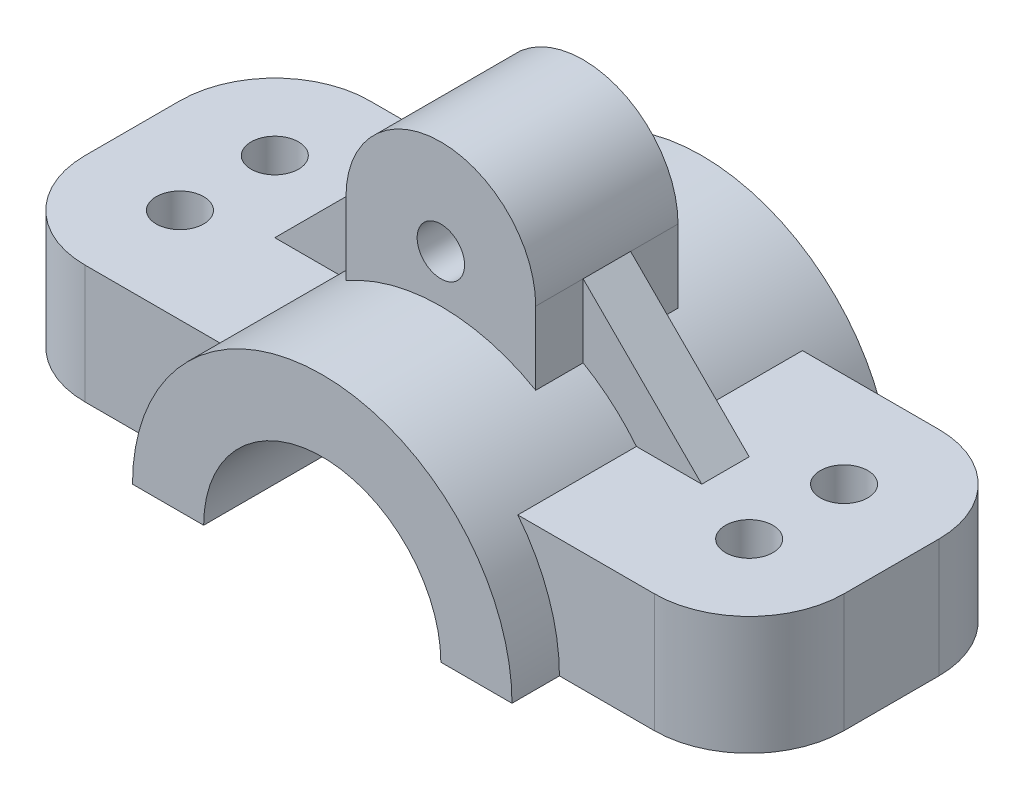
ISO-10303-21;
HEADER;
FILE_DESCRIPTION(('STEP AP214'),'2;1');
FILE_NAME('part.step','',(''),(''),'','','');
FILE_SCHEMA(('AUTOMOTIVE_DESIGN { 1 0 10303 214 1 1 1 1 }'));
ENDSEC;
DATA;
#1=APPLICATION_CONTEXT('core data for automotive mechanical design processes');
#2=APPLICATION_PROTOCOL_DEFINITION('international standard','automotive_design',2000,#1);
#3=PRODUCT_CONTEXT('',#1,'mechanical');
#4=PRODUCT('Part','Part','',(#3));
#5=PRODUCT_RELATED_PRODUCT_CATEGORY('part','',(#4));
#6=PRODUCT_DEFINITION_FORMATION('','',#4);
#7=PRODUCT_DEFINITION_CONTEXT('part definition',#1,'design');
#8=PRODUCT_DEFINITION('design','',#6,#7);
#9=PRODUCT_DEFINITION_SHAPE('','',#8);
#10=(LENGTH_UNIT() NAMED_UNIT(*) SI_UNIT(.MILLI.,.METRE.));
#11=(NAMED_UNIT(*) PLANE_ANGLE_UNIT() SI_UNIT($,.RADIAN.));
#12=(NAMED_UNIT(*) SI_UNIT($,.STERADIAN.) SOLID_ANGLE_UNIT());
#13=UNCERTAINTY_MEASURE_WITH_UNIT(LENGTH_MEASURE(1.E-05),#10,'distance_accuracy_value','');
#14=(GEOMETRIC_REPRESENTATION_CONTEXT(3) GLOBAL_UNCERTAINTY_ASSIGNED_CONTEXT((#13)) GLOBAL_UNIT_ASSIGNED_CONTEXT((#10,
#11,#12)) REPRESENTATION_CONTEXT('',''));
#15=CARTESIAN_POINT('',(0.,0.,0.));
#16=DIRECTION('',(0.,0.,1.));
#17=DIRECTION('',(1.,0.,0.));
#18=AXIS2_PLACEMENT_3D('',#15,#16,#17);
#19=CARTESIAN_POINT('',(0.,0.,40.));
#20=DIRECTION('',(0.,0.,-1.));
#21=DIRECTION('',(-1.,0.,0.));
#22=AXIS2_PLACEMENT_3D('',#19,#20,#21);
#23=CYLINDRICAL_SURFACE('',#22,40.);
#24=CARTESIAN_POINT('',(0.,0.,5.));
#25=DIRECTION('',(0.,0.,1.));
#26=DIRECTION('',(1.,0.,0.));
#27=AXIS2_PLACEMENT_3D('',#24,#25,#26);
#28=CIRCLE('',#27,40.);
#29=CARTESIAN_POINT('',(31.224989991992,25.,5.));
#30=VERTEX_POINT('',#29);
#31=CARTESIAN_POINT('',(20.,34.6410161513775,5.));
#32=VERTEX_POINT('',#31);
#33=EDGE_CURVE('E336',#30,#32,#28,.T.);
#34=ORIENTED_EDGE('',*,*,#33,.T.);
#35=DIRECTION('',(0.,0.,-1.));
#36=VECTOR('',#35,1.);
#37=CARTESIAN_POINT('',(20.,34.6410161513775,15.));
#38=LINE('',#37,#36);
#39=CARTESIAN_POINT('',(20.,34.6410161513775,15.));
#40=VERTEX_POINT('',#39);
#41=EDGE_CURVE('E290',#40,#32,#38,.T.);
#42=ORIENTED_EDGE('',*,*,#41,.F.);
#43=CARTESIAN_POINT('',(0.,0.,15.));
#44=DIRECTION('',(0.,0.,1.));
#45=DIRECTION('',(1.,0.,0.));
#46=AXIS2_PLACEMENT_3D('',#43,#44,#45);
#47=CIRCLE('',#46,40.);
#48=CARTESIAN_POINT('',(-20.,34.6410161513775,15.));
#49=VERTEX_POINT('',#48);
#50=EDGE_CURVE('E256',#40,#49,#47,.T.);
#51=ORIENTED_EDGE('',*,*,#50,.T.);
#52=DIRECTION('',(0.,0.,-1.));
#53=VECTOR('',#52,1.);
#54=CARTESIAN_POINT('',(-20.,34.6410161513775,15.));
#55=LINE('',#54,#53);
#56=CARTESIAN_POINT('',(-20.,34.6410161513775,5.));
#57=VERTEX_POINT('',#56);
#58=EDGE_CURVE('E294',#49,#57,#55,.T.);
#59=ORIENTED_EDGE('',*,*,#58,.T.);
#60=CARTESIAN_POINT('',(0.,0.,5.));
#61=DIRECTION('',(0.,0.,1.));
#62=DIRECTION('',(1.,0.,0.));
#63=AXIS2_PLACEMENT_3D('',#60,#61,#62);
#64=CIRCLE('',#63,40.);
#65=CARTESIAN_POINT('',(-31.224989991992,25.,5.));
#66=VERTEX_POINT('',#65);
#67=EDGE_CURVE('E301',#57,#66,#64,.T.);
#68=ORIENTED_EDGE('',*,*,#67,.T.);
#69=DIRECTION('',(0.,0.,-1.));
#70=VECTOR('',#69,1.);
#71=CARTESIAN_POINT('',(-31.224989991992,25.,30.));
#72=LINE('',#71,#70);
#73=CARTESIAN_POINT('',(-31.224989991992,25.,30.));
#74=VERTEX_POINT('',#73);
#75=EDGE_CURVE('E398',#74,#66,#72,.T.);
#76=ORIENTED_EDGE('',*,*,#75,.F.);
#77=CARTESIAN_POINT('',(0.,0.,30.));
#78=DIRECTION('',(0.,0.,1.));
#79=DIRECTION('',(1.,0.,0.));
#80=AXIS2_PLACEMENT_3D('',#77,#78,#79);
#81=CIRCLE('',#80,40.);
#82=CARTESIAN_POINT('',(-40.,0.,30.));
#83=VERTEX_POINT('',#82);
#84=EDGE_CURVE('E371',#74,#83,#81,.T.);
#85=ORIENTED_EDGE('',*,*,#84,.T.);
#86=DIRECTION('',(0.,0.,-1.));
#87=VECTOR('',#86,1.);
#88=CARTESIAN_POINT('',(-40.,0.,40.));
#89=LINE('',#88,#87);
#90=CARTESIAN_POINT('',(-40.,0.,40.));
#91=VERTEX_POINT('',#90);
#92=EDGE_CURVE('E465',#91,#83,#89,.T.);
#93=ORIENTED_EDGE('',*,*,#92,.F.);
#94=CARTESIAN_POINT('',(0.,0.,40.));
#95=DIRECTION('',(0.,0.,1.));
#96=DIRECTION('',(1.,0.,0.));
#97=AXIS2_PLACEMENT_3D('',#94,#95,#96);
#98=CIRCLE('',#97,40.);
#99=CARTESIAN_POINT('',(40.,0.,40.));
#100=VERTEX_POINT('',#99);
#101=EDGE_CURVE('E446',#100,#91,#98,.T.);
#102=ORIENTED_EDGE('',*,*,#101,.F.);
#103=DIRECTION('',(0.,0.,-1.));
#104=VECTOR('',#103,1.);
#105=CARTESIAN_POINT('',(40.,0.,40.));
#106=LINE('',#105,#104);
#107=CARTESIAN_POINT('',(40.,0.,30.));
#108=VERTEX_POINT('',#107);
#109=EDGE_CURVE('E470',#100,#108,#106,.T.);
#110=ORIENTED_EDGE('',*,*,#109,.T.);
#111=CARTESIAN_POINT('',(0.,0.,30.));
#112=DIRECTION('',(0.,0.,1.));
#113=DIRECTION('',(1.,0.,0.));
#114=AXIS2_PLACEMENT_3D('',#111,#112,#113);
#115=CIRCLE('',#114,40.);
#116=CARTESIAN_POINT('',(31.224989991992,25.,30.));
#117=VERTEX_POINT('',#116);
#118=EDGE_CURVE('E403',#108,#117,#115,.T.);
#119=ORIENTED_EDGE('',*,*,#118,.T.);
#120=DIRECTION('',(0.,0.,-1.));
#121=VECTOR('',#120,1.);
#122=CARTESIAN_POINT('',(31.224989991992,25.,30.));
#123=LINE('',#122,#121);
#124=EDGE_CURVE('E425',#117,#30,#123,.T.);
#125=ORIENTED_EDGE('',*,*,#124,.T.);
#126=EDGE_LOOP('',(#34,#42,#51,#59,#68,#76,#85,#93,#102,#110,#119,#125));
#127=FACE_BOUND('',#126,.T.);
#128=ADVANCED_FACE('F41',(#127),#23,.T.);
#129=CARTESIAN_POINT('',(0.,0.,40.));
#130=DIRECTION('',(0.,0.,-1.));
#131=DIRECTION('',(-1.,0.,0.));
#132=AXIS2_PLACEMENT_3D('',#129,#130,#131);
#133=CYLINDRICAL_SURFACE('',#132,25.);
#134=CARTESIAN_POINT('',(0.,0.,-40.));
#135=DIRECTION('',(0.,0.,1.));
#136=DIRECTION('',(1.,0.,0.));
#137=AXIS2_PLACEMENT_3D('',#134,#135,#136);
#138=CIRCLE('',#137,25.);
#139=CARTESIAN_POINT('',(25.,0.,-40.));
#140=VERTEX_POINT('',#139);
#141=CARTESIAN_POINT('',(-25.,0.,-40.));
#142=VERTEX_POINT('',#141);
#143=EDGE_CURVE('E437',#140,#142,#138,.T.);
#144=ORIENTED_EDGE('',*,*,#143,.F.);
#145=DIRECTION('',(0.,0.,-1.));
#146=VECTOR('',#145,1.);
#147=CARTESIAN_POINT('',(25.,0.,40.));
#148=LINE('',#147,#146);
#149=CARTESIAN_POINT('',(25.,0.,40.));
#150=VERTEX_POINT('',#149);
#151=EDGE_CURVE('E473',#150,#140,#148,.T.);
#152=ORIENTED_EDGE('',*,*,#151,.F.);
#153=CARTESIAN_POINT('',(0.,0.,40.));
#154=DIRECTION('',(0.,0.,1.));
#155=DIRECTION('',(1.,0.,0.));
#156=AXIS2_PLACEMENT_3D('',#153,#154,#155);
#157=CIRCLE('',#156,25.);
#158=CARTESIAN_POINT('',(-25.,0.,40.));
#159=VERTEX_POINT('',#158);
#160=EDGE_CURVE('E438',#150,#159,#157,.T.);
#161=ORIENTED_EDGE('',*,*,#160,.T.);
#162=DIRECTION('',(0.,0.,-1.));
#163=VECTOR('',#162,1.);
#164=CARTESIAN_POINT('',(-25.,0.,40.));
#165=LINE('',#164,#163);
#166=EDGE_CURVE('E461',#159,#142,#165,.T.);
#167=ORIENTED_EDGE('',*,*,#166,.T.);
#168=EDGE_LOOP('',(#144,#152,#161,#167));
#169=FACE_BOUND('',#168,.T.);
#170=ADVANCED_FACE('F632',(#169),#133,.F.);
#171=CARTESIAN_POINT('',(0.,0.,40.));
#172=DIRECTION('',(0.,1.,0.));
#173=DIRECTION('',(-1.,0.,0.));
#174=AXIS2_PLACEMENT_3D('',#171,#172,#173);
#175=PLANE('',#174);
#176=CARTESIAN_POINT('',(60.,0.,9.99999999999999));
#177=DIRECTION('',(0.,1.,0.));
#178=DIRECTION('',(0.,0.,1.));
#179=AXIS2_PLACEMENT_3D('',#176,#177,#178);
#180=CIRCLE('',#179,5.);
#181=CARTESIAN_POINT('',(60.,0.,15.));
#182=VERTEX_POINT('',#181);
#183=EDGE_CURVE('E665',#182,#182,#180,.T.);
#184=ORIENTED_EDGE('',*,*,#183,.T.);
#185=EDGE_LOOP('',(#184));
#186=FACE_BOUND('',#185,.T.);
#187=CARTESIAN_POINT('',(60.,0.,-10.));
#188=DIRECTION('',(0.,1.,0.));
#189=DIRECTION('',(0.,0.,1.));
#190=AXIS2_PLACEMENT_3D('',#187,#188,#189);
#191=CIRCLE('',#190,5.);
#192=CARTESIAN_POINT('',(60.,0.,-5.00000000000002));
#193=VERTEX_POINT('',#192);
#194=EDGE_CURVE('E277',#193,#193,#191,.T.);
#195=ORIENTED_EDGE('',*,*,#194,.T.);
#196=EDGE_LOOP('',(#195));
#197=FACE_BOUND('',#196,.T.);
#198=DIRECTION('',(1.,0.,0.));
#199=VECTOR('',#198,1.);
#200=CARTESIAN_POINT('',(0.,0.,-30.));
#201=LINE('',#200,#199);
#202=CARTESIAN_POINT('',(40.,0.,-30.));
#203=VERTEX_POINT('',#202);
#204=CARTESIAN_POINT('',(60.,0.,-30.));
#205=VERTEX_POINT('',#204);
#206=EDGE_CURVE('E419',#203,#205,#201,.T.);
#207=ORIENTED_EDGE('',*,*,#206,.T.);
#208=CARTESIAN_POINT('',(60.,0.,-9.99999999999999));
#209=DIRECTION('',(0.,1.,0.));
#210=DIRECTION('',(-1.,0.,0.));
#211=AXIS2_PLACEMENT_3D('',#208,#209,#210);
#212=CIRCLE('',#211,20.);
#213=CARTESIAN_POINT('',(80.,0.,-9.99999999999999));
#214=VERTEX_POINT('',#213);
#215=EDGE_CURVE('E495',#205,#214,#212,.F.);
#216=ORIENTED_EDGE('',*,*,#215,.T.);
#217=DIRECTION('',(0.,0.,-1.));
#218=VECTOR('',#217,1.);
#219=CARTESIAN_POINT('',(80.,0.,30.));
#220=LINE('',#219,#218);
#221=CARTESIAN_POINT('',(80.,0.,10.));
#222=VERTEX_POINT('',#221);
#223=EDGE_CURVE('E433',#222,#214,#220,.T.);
#224=ORIENTED_EDGE('',*,*,#223,.F.);
#225=CARTESIAN_POINT('',(60.,0.,10.));
#226=DIRECTION('',(0.,1.,0.));
#227=DIRECTION('',(-1.,0.,0.));
#228=AXIS2_PLACEMENT_3D('',#225,#226,#227);
#229=CIRCLE('',#228,20.);
#230=CARTESIAN_POINT('',(60.,0.,30.));
#231=VERTEX_POINT('',#230);
#232=EDGE_CURVE('E492',#222,#231,#229,.F.);
#233=ORIENTED_EDGE('',*,*,#232,.T.);
#234=DIRECTION('',(1.,0.,0.));
#235=VECTOR('',#234,1.);
#236=CARTESIAN_POINT('',(0.,0.,30.));
#237=LINE('',#236,#235);
#238=EDGE_CURVE('E407',#108,#231,#237,.T.);
#239=ORIENTED_EDGE('',*,*,#238,.F.);
#240=ORIENTED_EDGE('',*,*,#109,.F.);
#241=DIRECTION('',(1.,0.,0.));
#242=VECTOR('',#241,1.);
#243=CARTESIAN_POINT('',(0.,0.,40.));
#244=LINE('',#243,#242);
#245=EDGE_CURVE('E442',#150,#100,#244,.T.);
#246=ORIENTED_EDGE('',*,*,#245,.F.);
#247=ORIENTED_EDGE('',*,*,#151,.T.);
#248=DIRECTION('',(1.,0.,0.));
#249=VECTOR('',#248,1.);
#250=CARTESIAN_POINT('',(0.,0.,-40.));
#251=LINE('',#250,#249);
#252=CARTESIAN_POINT('',(40.,0.,-40.));
#253=VERTEX_POINT('',#252);
#254=EDGE_CURVE('E453',#140,#253,#251,.T.);
#255=ORIENTED_EDGE('',*,*,#254,.T.);
#256=EDGE_CURVE('E469',#203,#253,#106,.T.);
#257=ORIENTED_EDGE('',*,*,#256,.F.);
#258=EDGE_LOOP('',(#207,#216,#224,#233,#239,#240,#246,#247,#255,#257));
#259=FACE_BOUND('',#258,.T.);
#260=ADVANCED_FACE('F606',(#186,#197,#259),#175,.F.);
#261=CARTESIAN_POINT('',(0.,0.,-15.));
#262=DIRECTION('',(0.,0.,1.));
#263=DIRECTION('',(1.,0.,0.));
#264=AXIS2_PLACEMENT_3D('',#261,#262,#263);
#265=CIRCLE('',#264,40.);
#266=CARTESIAN_POINT('',(20.,34.6410161513775,-15.));
#267=VERTEX_POINT('',#266);
#268=CARTESIAN_POINT('',(-20.,34.6410161513775,-15.));
#269=VERTEX_POINT('',#268);
#270=EDGE_CURVE('E263',#267,#269,#265,.T.);
#271=ORIENTED_EDGE('',*,*,#270,.F.);
#272=CARTESIAN_POINT('',(20.,34.6410161513775,-5.));
#273=VERTEX_POINT('',#272);
#274=EDGE_CURVE('E271',#273,#267,#38,.T.);
#275=ORIENTED_EDGE('',*,*,#274,.F.);
#276=CARTESIAN_POINT('',(0.,0.,-5.));
#277=DIRECTION('',(0.,0.,1.));
#278=DIRECTION('',(1.,0.,0.));
#279=AXIS2_PLACEMENT_3D('',#276,#277,#278);
#280=CIRCLE('',#279,40.);
#281=CARTESIAN_POINT('',(31.224989991992,25.,-5.));
#282=VERTEX_POINT('',#281);
#283=EDGE_CURVE('E335',#282,#273,#280,.T.);
#284=ORIENTED_EDGE('',*,*,#283,.F.);
#285=CARTESIAN_POINT('',(31.224989991992,25.,-30.));
#286=VERTEX_POINT('',#285);
#287=EDGE_CURVE('E415',#282,#286,#123,.T.);
#288=ORIENTED_EDGE('',*,*,#287,.T.);
#289=CARTESIAN_POINT('',(0.,0.,-30.));
#290=DIRECTION('',(0.,0.,1.));
#291=DIRECTION('',(1.,0.,0.));
#292=AXIS2_PLACEMENT_3D('',#289,#290,#291);
#293=CIRCLE('',#292,40.);
#294=EDGE_CURVE('E402',#203,#286,#293,.T.);
#295=ORIENTED_EDGE('',*,*,#294,.F.);
#296=ORIENTED_EDGE('',*,*,#256,.T.);
#297=CARTESIAN_POINT('',(0.,0.,-40.));
#298=DIRECTION('',(0.,0.,1.));
#299=DIRECTION('',(1.,0.,0.));
#300=AXIS2_PLACEMENT_3D('',#297,#298,#299);
#301=CIRCLE('',#300,40.);
#302=CARTESIAN_POINT('',(-40.,0.,-40.));
#303=VERTEX_POINT('',#302);
#304=EDGE_CURVE('E457',#253,#303,#301,.T.);
#305=ORIENTED_EDGE('',*,*,#304,.T.);
#306=CARTESIAN_POINT('',(-40.,0.,-30.));
#307=VERTEX_POINT('',#306);
#308=EDGE_CURVE('E464',#307,#303,#89,.T.);
#309=ORIENTED_EDGE('',*,*,#308,.F.);
#310=CARTESIAN_POINT('',(0.,0.,-30.));
#311=DIRECTION('',(0.,0.,1.));
#312=DIRECTION('',(1.,0.,0.));
#313=AXIS2_PLACEMENT_3D('',#310,#311,#312);
#314=CIRCLE('',#313,40.);
#315=CARTESIAN_POINT('',(-31.224989991992,25.,-30.));
#316=VERTEX_POINT('',#315);
#317=EDGE_CURVE('E370',#316,#307,#314,.T.);
#318=ORIENTED_EDGE('',*,*,#317,.F.);
#319=CARTESIAN_POINT('',(-31.224989991992,25.,-5.));
#320=VERTEX_POINT('',#319);
#321=EDGE_CURVE('E397',#320,#316,#72,.T.);
#322=ORIENTED_EDGE('',*,*,#321,.F.);
#323=CARTESIAN_POINT('',(0.,0.,-5.));
#324=DIRECTION('',(0.,0.,1.));
#325=DIRECTION('',(1.,0.,0.));
#326=AXIS2_PLACEMENT_3D('',#323,#324,#325);
#327=CIRCLE('',#326,40.);
#328=CARTESIAN_POINT('',(-20.,34.6410161513775,-5.));
#329=VERTEX_POINT('',#328);
#330=EDGE_CURVE('E240',#329,#320,#327,.T.);
#331=ORIENTED_EDGE('',*,*,#330,.F.);
#332=EDGE_CURVE('E293',#329,#269,#55,.T.);
#333=ORIENTED_EDGE('',*,*,#332,.T.);
#334=EDGE_LOOP('',(#271,#275,#284,#288,#295,#296,#305,#309,#318,#322,#331,#333));
#335=FACE_BOUND('',#334,.T.);
#336=ADVANCED_FACE('F556',(#335),#23,.T.);
#337=CARTESIAN_POINT('',(-60.,0.,-10.));
#338=DIRECTION('',(0.,1.,0.));
#339=DIRECTION('',(0.,0.,1.));
#340=AXIS2_PLACEMENT_3D('',#337,#338,#339);
#341=CIRCLE('',#340,5.);
#342=CARTESIAN_POINT('',(-60.,0.,-5.));
#343=VERTEX_POINT('',#342);
#344=EDGE_CURVE('E689',#343,#343,#341,.T.);
#345=ORIENTED_EDGE('',*,*,#344,.T.);
#346=EDGE_LOOP('',(#345));
#347=FACE_BOUND('',#346,.T.);
#348=CARTESIAN_POINT('',(-60.,0.,10.));
#349=DIRECTION('',(0.,1.,0.));
#350=DIRECTION('',(0.,0.,1.));
#351=AXIS2_PLACEMENT_3D('',#348,#349,#350);
#352=CIRCLE('',#351,5.);
#353=CARTESIAN_POINT('',(-60.,0.,15.));
#354=VERTEX_POINT('',#353);
#355=EDGE_CURVE('E681',#354,#354,#352,.T.);
#356=ORIENTED_EDGE('',*,*,#355,.T.);
#357=EDGE_LOOP('',(#356));
#358=FACE_BOUND('',#357,.T.);
#359=DIRECTION('',(1.,0.,0.));
#360=VECTOR('',#359,1.);
#361=CARTESIAN_POINT('',(0.,0.,30.));
#362=LINE('',#361,#360);
#363=CARTESIAN_POINT('',(-60.,0.,30.));
#364=VERTEX_POINT('',#363);
#365=EDGE_CURVE('E379',#364,#83,#362,.T.);
#366=ORIENTED_EDGE('',*,*,#365,.F.);
#367=CARTESIAN_POINT('',(-60.,0.,10.));
#368=DIRECTION('',(0.,1.,0.));
#369=DIRECTION('',(-1.,0.,0.));
#370=AXIS2_PLACEMENT_3D('',#367,#368,#369);
#371=CIRCLE('',#370,20.);
#372=CARTESIAN_POINT('',(-80.,0.,10.));
#373=VERTEX_POINT('',#372);
#374=EDGE_CURVE('E50',#364,#373,#371,.F.);
#375=ORIENTED_EDGE('',*,*,#374,.T.);
#376=DIRECTION('',(0.,0.,-1.));
#377=VECTOR('',#376,1.);
#378=CARTESIAN_POINT('',(-80.,0.,30.));
#379=LINE('',#378,#377);
#380=CARTESIAN_POINT('',(-80.,0.,-9.99999999999999));
#381=VERTEX_POINT('',#380);
#382=EDGE_CURVE('E382',#373,#381,#379,.T.);
#383=ORIENTED_EDGE('',*,*,#382,.T.);
#384=CARTESIAN_POINT('',(-60.,0.,-10.));
#385=DIRECTION('',(0.,1.,0.));
#386=DIRECTION('',(-1.,0.,0.));
#387=AXIS2_PLACEMENT_3D('',#384,#385,#386);
#388=CIRCLE('',#387,20.);
#389=CARTESIAN_POINT('',(-60.,0.,-30.));
#390=VERTEX_POINT('',#389);
#391=EDGE_CURVE('E57',#381,#390,#388,.F.);
#392=ORIENTED_EDGE('',*,*,#391,.T.);
#393=DIRECTION('',(1.,0.,0.));
#394=VECTOR('',#393,1.);
#395=CARTESIAN_POINT('',(0.,0.,-30.));
#396=LINE('',#395,#394);
#397=EDGE_CURVE('E376',#390,#307,#396,.T.);
#398=ORIENTED_EDGE('',*,*,#397,.T.);
#399=ORIENTED_EDGE('',*,*,#308,.T.);
#400=EDGE_CURVE('E443',#303,#142,#251,.T.);
#401=ORIENTED_EDGE('',*,*,#400,.T.);
#402=ORIENTED_EDGE('',*,*,#166,.F.);
#403=EDGE_CURVE('E447',#91,#159,#244,.T.);
#404=ORIENTED_EDGE('',*,*,#403,.F.);
#405=ORIENTED_EDGE('',*,*,#92,.T.);
#406=EDGE_LOOP('',(#366,#375,#383,#392,#398,#399,#401,#402,#404,#405));
#407=FACE_BOUND('',#406,.T.);
#408=ADVANCED_FACE('F521',(#347,#358,#407),#175,.F.);
#409=CARTESIAN_POINT('',(0.,0.,40.));
#410=DIRECTION('',(0.,0.,1.));
#411=DIRECTION('',(1.,0.,0.));
#412=AXIS2_PLACEMENT_3D('',#409,#410,#411);
#413=PLANE('',#412);
#414=ORIENTED_EDGE('',*,*,#160,.F.);
#415=ORIENTED_EDGE('',*,*,#245,.T.);
#416=ORIENTED_EDGE('',*,*,#101,.T.);
#417=ORIENTED_EDGE('',*,*,#403,.T.);
#418=EDGE_LOOP('',(#414,#415,#416,#417));
#419=FACE_BOUND('',#418,.T.);
#420=ADVANCED_FACE('F636',(#419),#413,.T.);
#421=CARTESIAN_POINT('',(0.,0.,-40.));
#422=DIRECTION('',(0.,0.,1.));
#423=DIRECTION('',(1.,0.,0.));
#424=AXIS2_PLACEMENT_3D('',#421,#422,#423);
#425=PLANE('',#424);
#426=ORIENTED_EDGE('',*,*,#143,.T.);
#427=ORIENTED_EDGE('',*,*,#400,.F.);
#428=ORIENTED_EDGE('',*,*,#304,.F.);
#429=ORIENTED_EDGE('',*,*,#254,.F.);
#430=EDGE_LOOP('',(#426,#427,#428,#429));
#431=FACE_BOUND('',#430,.T.);
#432=ADVANCED_FACE('F630',(#431),#425,.F.);
#433=CARTESIAN_POINT('',(80.,0.,30.));
#434=DIRECTION('',(-1.,0.,0.));
#435=DIRECTION('',(0.,0.,1.));
#436=AXIS2_PLACEMENT_3D('',#433,#434,#435);
#437=PLANE('',#436);
#438=ORIENTED_EDGE('',*,*,#223,.T.);
#439=DIRECTION('',(0.,1.,0.));
#440=VECTOR('',#439,1.);
#441=CARTESIAN_POINT('',(80.,0.,-9.99999999999999));
#442=LINE('',#441,#440);
#443=CARTESIAN_POINT('',(80.,25.,-9.99999999999999));
#444=VERTEX_POINT('',#443);
#445=EDGE_CURVE('E479',#214,#444,#442,.T.);
#446=ORIENTED_EDGE('',*,*,#445,.T.);
#447=DIRECTION('',(0.,0.,-1.));
#448=VECTOR('',#447,1.);
#449=CARTESIAN_POINT('',(80.,25.,30.));
#450=LINE('',#449,#448);
#451=CARTESIAN_POINT('',(80.,25.,10.));
#452=VERTEX_POINT('',#451);
#453=EDGE_CURVE('E429',#452,#444,#450,.T.);
#454=ORIENTED_EDGE('',*,*,#453,.F.);
#455=DIRECTION('',(0.,1.,0.));
#456=VECTOR('',#455,1.);
#457=CARTESIAN_POINT('',(80.,0.,10.));
#458=LINE('',#457,#456);
#459=EDGE_CURVE('E476',#452,#222,#458,.F.);
#460=ORIENTED_EDGE('',*,*,#459,.T.);
#461=EDGE_LOOP('',(#438,#446,#454,#460));
#462=FACE_BOUND('',#461,.T.);
#463=ADVANCED_FACE('F603',(#462),#437,.F.);
#464=CARTESIAN_POINT('',(0.,25.,30.));
#465=DIRECTION('',(0.,-1.,0.));
#466=DIRECTION('',(0.,0.,-1.));
#467=AXIS2_PLACEMENT_3D('',#464,#465,#466);
#468=PLANE('',#467);
#469=CARTESIAN_POINT('',(60.,25.,9.99999999999999));
#470=DIRECTION('',(0.,1.,0.));
#471=DIRECTION('',(0.,0.,1.));
#472=AXIS2_PLACEMENT_3D('',#469,#470,#471);
#473=CIRCLE('',#472,5.);
#474=CARTESIAN_POINT('',(60.,25.,15.));
#475=VERTEX_POINT('',#474);
#476=EDGE_CURVE('E677',#475,#475,#473,.T.);
#477=ORIENTED_EDGE('',*,*,#476,.F.);
#478=EDGE_LOOP('',(#477));
#479=FACE_BOUND('',#478,.T.);
#480=CARTESIAN_POINT('',(60.,25.,-10.));
#481=DIRECTION('',(0.,1.,0.));
#482=DIRECTION('',(0.,0.,1.));
#483=AXIS2_PLACEMENT_3D('',#480,#481,#482);
#484=CIRCLE('',#483,5.);
#485=CARTESIAN_POINT('',(60.,25.,-5.00000000000002));
#486=VERTEX_POINT('',#485);
#487=EDGE_CURVE('E670',#486,#486,#484,.T.);
#488=ORIENTED_EDGE('',*,*,#487,.F.);
#489=EDGE_LOOP('',(#488));
#490=FACE_BOUND('',#489,.T.);
#491=ORIENTED_EDGE('',*,*,#453,.T.);
#492=CARTESIAN_POINT('',(60.,25.,-9.99999999999999));
#493=DIRECTION('',(0.,-1.,0.));
#494=DIRECTION('',(0.,0.,-1.));
#495=AXIS2_PLACEMENT_3D('',#492,#493,#494);
#496=CIRCLE('',#495,20.);
#497=CARTESIAN_POINT('',(60.,25.,-30.));
#498=VERTEX_POINT('',#497);
#499=EDGE_CURVE('E486',#444,#498,#496,.F.);
#500=ORIENTED_EDGE('',*,*,#499,.T.);
#501=DIRECTION('',(-1.,0.,0.));
#502=VECTOR('',#501,1.);
#503=CARTESIAN_POINT('',(0.,25.,-30.));
#504=LINE('',#503,#502);
#505=EDGE_CURVE('E408',#498,#286,#504,.T.);
#506=ORIENTED_EDGE('',*,*,#505,.T.);
#507=ORIENTED_EDGE('',*,*,#287,.F.);
#508=DIRECTION('',(-1.,0.,0.));
#509=VECTOR('',#508,1.);
#510=CARTESIAN_POINT('',(0.,25.,-5.));
#511=LINE('',#510,#509);
#512=CARTESIAN_POINT('',(45.,25.,-5.));
#513=VERTEX_POINT('',#512);
#514=EDGE_CURVE('E354',#513,#282,#511,.T.);
#515=ORIENTED_EDGE('',*,*,#514,.F.);
#516=DIRECTION('',(0.,0.,-1.));
#517=VECTOR('',#516,1.);
#518=CARTESIAN_POINT('',(45.,25.,5.));
#519=LINE('',#518,#517);
#520=CARTESIAN_POINT('',(45.,25.,5.));
#521=VERTEX_POINT('',#520);
#522=EDGE_CURVE('E366',#521,#513,#519,.T.);
#523=ORIENTED_EDGE('',*,*,#522,.F.);
#524=DIRECTION('',(-1.,0.,0.));
#525=VECTOR('',#524,1.);
#526=CARTESIAN_POINT('',(0.,25.,5.));
#527=LINE('',#526,#525);
#528=EDGE_CURVE('E340',#521,#30,#527,.T.);
#529=ORIENTED_EDGE('',*,*,#528,.T.);
#530=ORIENTED_EDGE('',*,*,#124,.F.);
#531=DIRECTION('',(-1.,0.,0.));
#532=VECTOR('',#531,1.);
#533=CARTESIAN_POINT('',(0.,25.,30.));
#534=LINE('',#533,#532);
#535=CARTESIAN_POINT('',(60.,25.,30.));
#536=VERTEX_POINT('',#535);
#537=EDGE_CURVE('E412',#536,#117,#534,.T.);
#538=ORIENTED_EDGE('',*,*,#537,.F.);
#539=CARTESIAN_POINT('',(60.,25.,10.));
#540=DIRECTION('',(0.,-1.,0.));
#541=DIRECTION('',(0.,0.,-1.));
#542=AXIS2_PLACEMENT_3D('',#539,#540,#541);
#543=CIRCLE('',#542,20.);
#544=EDGE_CURVE('E483',#536,#452,#543,.F.);
#545=ORIENTED_EDGE('',*,*,#544,.T.);
#546=EDGE_LOOP('',(#491,#500,#506,#507,#515,#523,#529,#530,#538,#545));
#547=FACE_BOUND('',#546,.T.);
#548=ADVANCED_FACE('F585',(#479,#490,#547),#468,.F.);
#549=CARTESIAN_POINT('',(0.,0.,30.));
#550=DIRECTION('',(0.,0.,1.));
#551=DIRECTION('',(1.,0.,0.));
#552=AXIS2_PLACEMENT_3D('',#549,#550,#551);
#553=PLANE('',#552);
#554=ORIENTED_EDGE('',*,*,#238,.T.);
#555=DIRECTION('',(0.,1.,0.));
#556=VECTOR('',#555,1.);
#557=CARTESIAN_POINT('',(60.,25.,30.));
#558=LINE('',#557,#556);
#559=EDGE_CURVE('E498',#231,#536,#558,.T.);
#560=ORIENTED_EDGE('',*,*,#559,.T.);
#561=ORIENTED_EDGE('',*,*,#537,.T.);
#562=ORIENTED_EDGE('',*,*,#118,.F.);
#563=EDGE_LOOP('',(#554,#560,#561,#562));
#564=FACE_BOUND('',#563,.T.);
#565=ADVANCED_FACE('F594',(#564),#553,.T.);
#566=CARTESIAN_POINT('',(0.,0.,-30.));
#567=DIRECTION('',(0.,0.,1.));
#568=DIRECTION('',(1.,0.,0.));
#569=AXIS2_PLACEMENT_3D('',#566,#567,#568);
#570=PLANE('',#569);
#571=ORIENTED_EDGE('',*,*,#505,.F.);
#572=DIRECTION('',(0.,1.,0.));
#573=VECTOR('',#572,1.);
#574=CARTESIAN_POINT('',(60.,0.,-30.));
#575=LINE('',#574,#573);
#576=EDGE_CURVE('E489',#498,#205,#575,.F.);
#577=ORIENTED_EDGE('',*,*,#576,.T.);
#578=ORIENTED_EDGE('',*,*,#206,.F.);
#579=ORIENTED_EDGE('',*,*,#294,.T.);
#580=EDGE_LOOP('',(#571,#577,#578,#579));
#581=FACE_BOUND('',#580,.T.);
#582=ADVANCED_FACE('F616',(#581),#570,.F.);
#583=CARTESIAN_POINT('',(0.,25.,30.));
#584=DIRECTION('',(0.,1.,0.));
#585=DIRECTION('',(-1.,0.,0.));
#586=AXIS2_PLACEMENT_3D('',#583,#584,#585);
#587=PLANE('',#586);
#588=CARTESIAN_POINT('',(-60.,25.,-10.));
#589=DIRECTION('',(0.,1.,0.));
#590=DIRECTION('',(0.,0.,1.));
#591=AXIS2_PLACEMENT_3D('',#588,#589,#590);
#592=CIRCLE('',#591,5.);
#593=CARTESIAN_POINT('',(-60.,25.,-5.));
#594=VERTEX_POINT('',#593);
#595=EDGE_CURVE('E693',#594,#594,#592,.T.);
#596=ORIENTED_EDGE('',*,*,#595,.F.);
#597=EDGE_LOOP('',(#596));
#598=FACE_BOUND('',#597,.T.);
#599=CARTESIAN_POINT('',(-60.,25.,10.));
#600=DIRECTION('',(0.,1.,0.));
#601=DIRECTION('',(0.,0.,1.));
#602=AXIS2_PLACEMENT_3D('',#599,#600,#601);
#603=CIRCLE('',#602,5.);
#604=CARTESIAN_POINT('',(-60.,25.,15.));
#605=VERTEX_POINT('',#604);
#606=EDGE_CURVE('E685',#605,#605,#603,.T.);
#607=ORIENTED_EDGE('',*,*,#606,.F.);
#608=EDGE_LOOP('',(#607));
#609=FACE_BOUND('',#608,.T.);
#610=DIRECTION('',(0.,0.,-1.));
#611=VECTOR('',#610,1.);
#612=CARTESIAN_POINT('',(-80.,25.,30.));
#613=LINE('',#612,#611);
#614=CARTESIAN_POINT('',(-80.,25.,10.));
#615=VERTEX_POINT('',#614);
#616=CARTESIAN_POINT('',(-80.,25.,-9.99999999999999));
#617=VERTEX_POINT('',#616);
#618=EDGE_CURVE('E393',#615,#617,#613,.T.);
#619=ORIENTED_EDGE('',*,*,#618,.F.);
#620=CARTESIAN_POINT('',(-60.,25.,10.));
#621=DIRECTION('',(0.,1.,0.));
#622=DIRECTION('',(-1.,0.,0.));
#623=AXIS2_PLACEMENT_3D('',#620,#621,#622);
#624=CIRCLE('',#623,20.);
#625=CARTESIAN_POINT('',(-60.,25.,30.));
#626=VERTEX_POINT('',#625);
#627=EDGE_CURVE('E512',#615,#626,#624,.T.);
#628=ORIENTED_EDGE('',*,*,#627,.T.);
#629=DIRECTION('',(1.,0.,0.));
#630=VECTOR('',#629,1.);
#631=CARTESIAN_POINT('',(0.,25.,30.));
#632=LINE('',#631,#630);
#633=EDGE_CURVE('E375',#626,#74,#632,.T.);
#634=ORIENTED_EDGE('',*,*,#633,.T.);
#635=ORIENTED_EDGE('',*,*,#75,.T.);
#636=DIRECTION('',(1.,0.,0.));
#637=VECTOR('',#636,1.);
#638=CARTESIAN_POINT('',(0.,25.,5.));
#639=LINE('',#638,#637);
#640=CARTESIAN_POINT('',(-45.,25.,5.));
#641=VERTEX_POINT('',#640);
#642=EDGE_CURVE('E312',#641,#66,#639,.T.);
#643=ORIENTED_EDGE('',*,*,#642,.F.);
#644=DIRECTION('',(0.,0.,-1.));
#645=VECTOR('',#644,1.);
#646=CARTESIAN_POINT('',(-45.,25.,5.));
#647=LINE('',#646,#645);
#648=CARTESIAN_POINT('',(-45.,25.,-5.));
#649=VERTEX_POINT('',#648);
#650=EDGE_CURVE('E315',#641,#649,#647,.T.);
#651=ORIENTED_EDGE('',*,*,#650,.T.);
#652=DIRECTION('',(1.,0.,0.));
#653=VECTOR('',#652,1.);
#654=CARTESIAN_POINT('',(0.,25.,-5.));
#655=LINE('',#654,#653);
#656=EDGE_CURVE('E306',#649,#320,#655,.T.);
#657=ORIENTED_EDGE('',*,*,#656,.T.);
#658=ORIENTED_EDGE('',*,*,#321,.T.);
#659=DIRECTION('',(1.,0.,0.));
#660=VECTOR('',#659,1.);
#661=CARTESIAN_POINT('',(0.,25.,-30.));
#662=LINE('',#661,#660);
#663=CARTESIAN_POINT('',(-60.,25.,-30.));
#664=VERTEX_POINT('',#663);
#665=EDGE_CURVE('E386',#664,#316,#662,.T.);
#666=ORIENTED_EDGE('',*,*,#665,.F.);
#667=CARTESIAN_POINT('',(-60.,25.,-10.));
#668=DIRECTION('',(0.,1.,0.));
#669=DIRECTION('',(-1.,0.,0.));
#670=AXIS2_PLACEMENT_3D('',#667,#668,#669);
#671=CIRCLE('',#670,20.);
#672=EDGE_CURVE('E509',#664,#617,#671,.T.);
#673=ORIENTED_EDGE('',*,*,#672,.T.);
#674=EDGE_LOOP('',(#619,#628,#634,#635,#643,#651,#657,#658,#666,#673));
#675=FACE_BOUND('',#674,.T.);
#676=ADVANCED_FACE('F530',(#598,#609,#675),#587,.T.);
#677=CARTESIAN_POINT('',(-80.,0.,30.));
#678=DIRECTION('',(-1.,0.,0.));
#679=DIRECTION('',(0.,0.,1.));
#680=AXIS2_PLACEMENT_3D('',#677,#678,#679);
#681=PLANE('',#680);
#682=ORIENTED_EDGE('',*,*,#382,.F.);
#683=DIRECTION('',(0.,1.,0.));
#684=VECTOR('',#683,1.);
#685=CARTESIAN_POINT('',(-80.,0.,10.));
#686=LINE('',#685,#684);
#687=EDGE_CURVE('E505',#373,#615,#686,.T.);
#688=ORIENTED_EDGE('',*,*,#687,.T.);
#689=ORIENTED_EDGE('',*,*,#618,.T.);
#690=DIRECTION('',(0.,1.,0.));
#691=VECTOR('',#690,1.);
#692=CARTESIAN_POINT('',(-80.,0.,-10.));
#693=LINE('',#692,#691);
#694=EDGE_CURVE('E502',#617,#381,#693,.F.);
#695=ORIENTED_EDGE('',*,*,#694,.T.);
#696=EDGE_LOOP('',(#682,#688,#689,#695));
#697=FACE_BOUND('',#696,.T.);
#698=ADVANCED_FACE('F525',(#697),#681,.T.);
#699=CARTESIAN_POINT('',(0.,0.,30.));
#700=DIRECTION('',(0.,0.,1.));
#701=DIRECTION('',(1.,0.,0.));
#702=AXIS2_PLACEMENT_3D('',#699,#700,#701);
#703=PLANE('',#702);
#704=ORIENTED_EDGE('',*,*,#633,.F.);
#705=DIRECTION('',(0.,1.,0.));
#706=VECTOR('',#705,1.);
#707=CARTESIAN_POINT('',(-60.,0.,30.));
#708=LINE('',#707,#706);
#709=EDGE_CURVE('E65',#626,#364,#708,.F.);
#710=ORIENTED_EDGE('',*,*,#709,.T.);
#711=ORIENTED_EDGE('',*,*,#365,.T.);
#712=ORIENTED_EDGE('',*,*,#84,.F.);
#713=EDGE_LOOP('',(#704,#710,#711,#712));
#714=FACE_BOUND('',#713,.T.);
#715=ADVANCED_FACE('F532',(#714),#703,.T.);
#716=CARTESIAN_POINT('',(0.,0.,-30.));
#717=DIRECTION('',(0.,0.,1.));
#718=DIRECTION('',(1.,0.,0.));
#719=AXIS2_PLACEMENT_3D('',#716,#717,#718);
#720=PLANE('',#719);
#721=ORIENTED_EDGE('',*,*,#397,.F.);
#722=DIRECTION('',(0.,1.,0.));
#723=VECTOR('',#722,1.);
#724=CARTESIAN_POINT('',(-60.,25.,-30.));
#725=LINE('',#724,#723);
#726=EDGE_CURVE('E11',#390,#664,#725,.T.);
#727=ORIENTED_EDGE('',*,*,#726,.T.);
#728=ORIENTED_EDGE('',*,*,#665,.T.);
#729=ORIENTED_EDGE('',*,*,#317,.T.);
#730=EDGE_LOOP('',(#721,#727,#728,#729));
#731=FACE_BOUND('',#730,.T.);
#732=ADVANCED_FACE('F753',(#731),#720,.F.);
#733=CARTESIAN_POINT('',(35.,35.,5.));
#734=DIRECTION('',(0.707106781186548,0.707106781186547,0.));
#735=DIRECTION('',(-0.707106781186547,0.707106781186548,0.));
#736=AXIS2_PLACEMENT_3D('',#733,#734,#735);
#737=PLANE('',#736);
#738=DIRECTION('',(0.707106781186547,-0.707106781186548,0.));
#739=VECTOR('',#738,1.);
#740=CARTESIAN_POINT('',(35.,35.,-5.));
#741=LINE('',#740,#739);
#742=CARTESIAN_POINT('',(20.,50.,-5.));
#743=VERTEX_POINT('',#742);
#744=EDGE_CURVE('E358',#743,#513,#741,.T.);
#745=ORIENTED_EDGE('',*,*,#744,.F.);
#746=DIRECTION('',(0.,0.,-1.));
#747=VECTOR('',#746,1.);
#748=CARTESIAN_POINT('',(20.,50.,5.));
#749=LINE('',#748,#747);
#750=CARTESIAN_POINT('',(20.,50.,5.));
#751=VERTEX_POINT('',#750);
#752=EDGE_CURVE('E350',#751,#743,#749,.T.);
#753=ORIENTED_EDGE('',*,*,#752,.F.);
#754=DIRECTION('',(0.707106781186547,-0.707106781186548,0.));
#755=VECTOR('',#754,1.);
#756=CARTESIAN_POINT('',(35.,35.,5.));
#757=LINE('',#756,#755);
#758=EDGE_CURVE('E344',#751,#521,#757,.T.);
#759=ORIENTED_EDGE('',*,*,#758,.T.);
#760=ORIENTED_EDGE('',*,*,#522,.T.);
#761=EDGE_LOOP('',(#745,#753,#759,#760));
#762=FACE_BOUND('',#761,.T.);
#763=ADVANCED_FACE('F582',(#762),#737,.T.);
#764=CARTESIAN_POINT('',(0.,0.,5.));
#765=DIRECTION('',(0.,0.,1.));
#766=DIRECTION('',(1.,0.,0.));
#767=AXIS2_PLACEMENT_3D('',#764,#765,#766);
#768=PLANE('',#767);
#769=ORIENTED_EDGE('',*,*,#33,.F.);
#770=ORIENTED_EDGE('',*,*,#528,.F.);
#771=ORIENTED_EDGE('',*,*,#758,.F.);
#772=DIRECTION('',(0.,-1.,0.));
#773=VECTOR('',#772,1.);
#774=CARTESIAN_POINT('',(20.,0.,5.));
#775=LINE('',#774,#773);
#776=EDGE_CURVE('E235',#751,#32,#775,.T.);
#777=ORIENTED_EDGE('',*,*,#776,.T.);
#778=EDGE_LOOP('',(#769,#770,#771,#777));
#779=FACE_BOUND('',#778,.T.);
#780=ADVANCED_FACE('F589',(#779),#768,.T.);
#781=CARTESIAN_POINT('',(0.,0.,-5.));
#782=DIRECTION('',(0.,0.,1.));
#783=DIRECTION('',(1.,0.,0.));
#784=AXIS2_PLACEMENT_3D('',#781,#782,#783);
#785=PLANE('',#784);
#786=ORIENTED_EDGE('',*,*,#283,.T.);
#787=DIRECTION('',(0.,-1.,0.));
#788=VECTOR('',#787,1.);
#789=CARTESIAN_POINT('',(20.,0.,-5.));
#790=LINE('',#789,#788);
#791=EDGE_CURVE('E341',#743,#273,#790,.T.);
#792=ORIENTED_EDGE('',*,*,#791,.F.);
#793=ORIENTED_EDGE('',*,*,#744,.T.);
#794=ORIENTED_EDGE('',*,*,#514,.T.);
#795=EDGE_LOOP('',(#786,#792,#793,#794));
#796=FACE_BOUND('',#795,.T.);
#797=ADVANCED_FACE('F581',(#796),#785,.F.);
#798=CARTESIAN_POINT('',(-35.,35.,5.));
#799=DIRECTION('',(0.707106781186548,-0.707106781186547,0.));
#800=DIRECTION('',(0.707106781186547,0.707106781186548,0.));
#801=AXIS2_PLACEMENT_3D('',#798,#799,#800);
#802=PLANE('',#801);
#803=DIRECTION('',(-0.707106781186547,-0.707106781186548,0.));
#804=VECTOR('',#803,1.);
#805=CARTESIAN_POINT('',(-35.,35.,-5.));
#806=LINE('',#805,#804);
#807=CARTESIAN_POINT('',(-20.,50.,-5.));
#808=VERTEX_POINT('',#807);
#809=EDGE_CURVE('E322',#808,#649,#806,.T.);
#810=ORIENTED_EDGE('',*,*,#809,.T.);
#811=ORIENTED_EDGE('',*,*,#650,.F.);
#812=DIRECTION('',(-0.707106781186547,-0.707106781186548,0.));
#813=VECTOR('',#812,1.);
#814=CARTESIAN_POINT('',(-35.,35.,5.));
#815=LINE('',#814,#813);
#816=CARTESIAN_POINT('',(-20.,50.,5.));
#817=VERTEX_POINT('',#816);
#818=EDGE_CURVE('E309',#817,#641,#815,.T.);
#819=ORIENTED_EDGE('',*,*,#818,.F.);
#820=DIRECTION('',(0.,0.,-1.));
#821=VECTOR('',#820,1.);
#822=CARTESIAN_POINT('',(-20.,50.,5.));
#823=LINE('',#822,#821);
#824=EDGE_CURVE('E331',#817,#808,#823,.T.);
#825=ORIENTED_EDGE('',*,*,#824,.T.);
#826=EDGE_LOOP('',(#810,#811,#819,#825));
#827=FACE_BOUND('',#826,.T.);
#828=ADVANCED_FACE('F544',(#827),#802,.F.);
#829=CARTESIAN_POINT('',(0.,0.,5.));
#830=DIRECTION('',(0.,0.,1.));
#831=DIRECTION('',(1.,0.,0.));
#832=AXIS2_PLACEMENT_3D('',#829,#830,#831);
#833=PLANE('',#832);
#834=ORIENTED_EDGE('',*,*,#67,.F.);
#835=DIRECTION('',(0.,-1.,0.));
#836=VECTOR('',#835,1.);
#837=CARTESIAN_POINT('',(-20.,0.,5.));
#838=LINE('',#837,#836);
#839=EDGE_CURVE('E305',#817,#57,#838,.T.);
#840=ORIENTED_EDGE('',*,*,#839,.F.);
#841=ORIENTED_EDGE('',*,*,#818,.T.);
#842=ORIENTED_EDGE('',*,*,#642,.T.);
#843=EDGE_LOOP('',(#834,#840,#841,#842));
#844=FACE_BOUND('',#843,.T.);
#845=ADVANCED_FACE('F540',(#844),#833,.T.);
#846=CARTESIAN_POINT('',(0.,0.,-5.));
#847=DIRECTION('',(0.,0.,1.));
#848=DIRECTION('',(1.,0.,0.));
#849=AXIS2_PLACEMENT_3D('',#846,#847,#848);
#850=PLANE('',#849);
#851=ORIENTED_EDGE('',*,*,#330,.T.);
#852=ORIENTED_EDGE('',*,*,#656,.F.);
#853=ORIENTED_EDGE('',*,*,#809,.F.);
#854=DIRECTION('',(0.,-1.,0.));
#855=VECTOR('',#854,1.);
#856=CARTESIAN_POINT('',(-20.,0.,-5.));
#857=LINE('',#856,#855);
#858=EDGE_CURVE('E318',#808,#329,#857,.T.);
#859=ORIENTED_EDGE('',*,*,#858,.T.);
#860=EDGE_LOOP('',(#851,#852,#853,#859));
#861=FACE_BOUND('',#860,.T.);
#862=ADVANCED_FACE('F548',(#861),#850,.F.);
#863=CARTESIAN_POINT('',(20.,0.,15.));
#864=DIRECTION('',(1.,0.,0.));
#865=DIRECTION('',(0.,0.,-1.));
#866=AXIS2_PLACEMENT_3D('',#863,#864,#865);
#867=PLANE('',#866);
#868=ORIENTED_EDGE('',*,*,#791,.T.);
#869=ORIENTED_EDGE('',*,*,#274,.T.);
#870=DIRECTION('',(0.,-1.,0.));
#871=VECTOR('',#870,1.);
#872=CARTESIAN_POINT('',(20.,0.,-15.));
#873=LINE('',#872,#871);
#874=CARTESIAN_POINT('',(20.,50.,-15.));
#875=VERTEX_POINT('',#874);
#876=EDGE_CURVE('E276',#875,#267,#873,.T.);
#877=ORIENTED_EDGE('',*,*,#876,.F.);
#878=DIRECTION('',(0.,0.,-1.));
#879=VECTOR('',#878,1.);
#880=CARTESIAN_POINT('',(20.,50.,15.));
#881=LINE('',#880,#879);
#882=EDGE_CURVE('E241',#743,#875,#881,.T.);
#883=ORIENTED_EDGE('',*,*,#882,.F.);
#884=EDGE_LOOP('',(#868,#869,#877,#883));
#885=FACE_BOUND('',#884,.T.);
#886=ADVANCED_FACE('F567',(#885),#867,.T.);
#887=CARTESIAN_POINT('',(-20.,0.,15.));
#888=DIRECTION('',(1.,0.,0.));
#889=DIRECTION('',(0.,1.,0.));
#890=AXIS2_PLACEMENT_3D('',#887,#888,#889);
#891=PLANE('',#890);
#892=ORIENTED_EDGE('',*,*,#332,.F.);
#893=ORIENTED_EDGE('',*,*,#858,.F.);
#894=DIRECTION('',(0.,0.,-1.));
#895=VECTOR('',#894,1.);
#896=CARTESIAN_POINT('',(-20.,50.,15.));
#897=LINE('',#896,#895);
#898=CARTESIAN_POINT('',(-20.,50.,-15.));
#899=VERTEX_POINT('',#898);
#900=EDGE_CURVE('E298',#808,#899,#897,.T.);
#901=ORIENTED_EDGE('',*,*,#900,.T.);
#902=DIRECTION('',(0.,-1.,0.));
#903=VECTOR('',#902,1.);
#904=CARTESIAN_POINT('',(-20.,0.,-15.));
#905=LINE('',#904,#903);
#906=EDGE_CURVE('E284',#899,#269,#905,.T.);
#907=ORIENTED_EDGE('',*,*,#906,.T.);
#908=EDGE_LOOP('',(#892,#893,#901,#907));
#909=FACE_BOUND('',#908,.T.);
#910=ADVANCED_FACE('F575',(#909),#891,.F.);
#911=ORIENTED_EDGE('',*,*,#41,.T.);
#912=ORIENTED_EDGE('',*,*,#776,.F.);
#913=CARTESIAN_POINT('',(20.,50.,15.));
#914=VERTEX_POINT('',#913);
#915=EDGE_CURVE('E228',#914,#751,#881,.T.);
#916=ORIENTED_EDGE('',*,*,#915,.F.);
#917=DIRECTION('',(0.,-1.,0.));
#918=VECTOR('',#917,1.);
#919=CARTESIAN_POINT('',(20.,0.,15.));
#920=LINE('',#919,#918);
#921=EDGE_CURVE('E232',#914,#40,#920,.T.);
#922=ORIENTED_EDGE('',*,*,#921,.T.);
#923=EDGE_LOOP('',(#911,#912,#916,#922));
#924=FACE_BOUND('',#923,.T.);
#925=ADVANCED_FACE('F230',(#924),#867,.T.);
#926=CARTESIAN_POINT('',(0.,50.,15.));
#927=DIRECTION('',(0.,0.,-1.));
#928=DIRECTION('',(-1.,0.,0.));
#929=AXIS2_PLACEMENT_3D('',#926,#927,#928);
#930=CYLINDRICAL_SURFACE('',#929,20.);
#931=CARTESIAN_POINT('',(0.,50.,-15.));
#932=DIRECTION('',(0.,0.,1.));
#933=DIRECTION('',(1.,0.,0.));
#934=AXIS2_PLACEMENT_3D('',#931,#932,#933);
#935=CIRCLE('',#934,20.);
#936=EDGE_CURVE('E281',#875,#899,#935,.T.);
#937=ORIENTED_EDGE('',*,*,#936,.T.);
#938=ORIENTED_EDGE('',*,*,#900,.F.);
#939=ORIENTED_EDGE('',*,*,#824,.F.);
#940=CARTESIAN_POINT('',(-20.,50.,15.));
#941=VERTEX_POINT('',#940);
#942=EDGE_CURVE('E249',#941,#817,#897,.T.);
#943=ORIENTED_EDGE('',*,*,#942,.F.);
#944=CARTESIAN_POINT('',(0.,50.,15.));
#945=DIRECTION('',(0.,0.,1.));
#946=DIRECTION('',(1.,0.,0.));
#947=AXIS2_PLACEMENT_3D('',#944,#945,#946);
#948=CIRCLE('',#947,20.);
#949=EDGE_CURVE('E245',#914,#941,#948,.T.);
#950=ORIENTED_EDGE('',*,*,#949,.F.);
#951=ORIENTED_EDGE('',*,*,#915,.T.);
#952=ORIENTED_EDGE('',*,*,#752,.T.);
#953=ORIENTED_EDGE('',*,*,#882,.T.);
#954=EDGE_LOOP('',(#937,#938,#939,#943,#950,#951,#952,#953));
#955=FACE_BOUND('',#954,.T.);
#956=ADVANCED_FACE('F247',(#955),#930,.T.);
#957=ORIENTED_EDGE('',*,*,#839,.T.);
#958=ORIENTED_EDGE('',*,*,#58,.F.);
#959=DIRECTION('',(0.,-1.,0.));
#960=VECTOR('',#959,1.);
#961=CARTESIAN_POINT('',(-20.,0.,15.));
#962=LINE('',#961,#960);
#963=EDGE_CURVE('E252',#941,#49,#962,.T.);
#964=ORIENTED_EDGE('',*,*,#963,.F.);
#965=ORIENTED_EDGE('',*,*,#942,.T.);
#966=EDGE_LOOP('',(#957,#958,#964,#965));
#967=FACE_BOUND('',#966,.T.);
#968=ADVANCED_FACE('F730',(#967),#891,.F.);
#969=CARTESIAN_POINT('',(0.,50.,15.));
#970=DIRECTION('',(0.,0.,-1.));
#971=DIRECTION('',(-1.,0.,0.));
#972=AXIS2_PLACEMENT_3D('',#969,#970,#971);
#973=CYLINDRICAL_SURFACE('',#972,5.);
#974=CARTESIAN_POINT('',(0.,50.,15.));
#975=DIRECTION('',(0.,0.,1.));
#976=DIRECTION('',(1.,0.,0.));
#977=AXIS2_PLACEMENT_3D('',#974,#975,#976);
#978=CIRCLE('',#977,5.);
#979=CARTESIAN_POINT('',(5.00000000000001,50.,15.));
#980=VERTEX_POINT('',#979);
#981=EDGE_CURVE('E259',#980,#980,#978,.T.);
#982=ORIENTED_EDGE('',*,*,#981,.T.);
#983=EDGE_LOOP('',(#982));
#984=FACE_BOUND('',#983,.T.);
#985=CARTESIAN_POINT('',(0.,50.,-15.));
#986=DIRECTION('',(0.,0.,1.));
#987=DIRECTION('',(1.,0.,0.));
#988=AXIS2_PLACEMENT_3D('',#985,#986,#987);
#989=CIRCLE('',#988,5.);
#990=CARTESIAN_POINT('',(5.00000000000001,50.,-15.));
#991=VERTEX_POINT('',#990);
#992=EDGE_CURVE('E272',#991,#991,#989,.T.);
#993=ORIENTED_EDGE('',*,*,#992,.F.);
#994=EDGE_LOOP('',(#993));
#995=FACE_BOUND('',#994,.T.);
#996=ADVANCED_FACE('F725',(#984,#995),#973,.F.);
#997=CARTESIAN_POINT('',(0.,0.,15.));
#998=DIRECTION('',(0.,0.,1.));
#999=DIRECTION('',(1.,0.,0.));
#1000=AXIS2_PLACEMENT_3D('',#997,#998,#999);
#1001=PLANE('',#1000);
#1002=ORIENTED_EDGE('',*,*,#981,.F.);
#1003=EDGE_LOOP('',(#1002));
#1004=FACE_BOUND('',#1003,.T.);
#1005=ORIENTED_EDGE('',*,*,#921,.F.);
#1006=ORIENTED_EDGE('',*,*,#949,.T.);
#1007=ORIENTED_EDGE('',*,*,#963,.T.);
#1008=ORIENTED_EDGE('',*,*,#50,.F.);
#1009=EDGE_LOOP('',(#1005,#1006,#1007,#1008));
#1010=FACE_BOUND('',#1009,.T.);
#1011=ADVANCED_FACE('F254',(#1004,#1010),#1001,.T.);
#1012=CARTESIAN_POINT('',(0.,0.,-15.));
#1013=DIRECTION('',(0.,0.,1.));
#1014=DIRECTION('',(1.,0.,0.));
#1015=AXIS2_PLACEMENT_3D('',#1012,#1013,#1014);
#1016=PLANE('',#1015);
#1017=ORIENTED_EDGE('',*,*,#992,.T.);
#1018=EDGE_LOOP('',(#1017));
#1019=FACE_BOUND('',#1018,.T.);
#1020=ORIENTED_EDGE('',*,*,#876,.T.);
#1021=ORIENTED_EDGE('',*,*,#270,.T.);
#1022=ORIENTED_EDGE('',*,*,#906,.F.);
#1023=ORIENTED_EDGE('',*,*,#936,.F.);
#1024=EDGE_LOOP('',(#1020,#1021,#1022,#1023));
#1025=FACE_BOUND('',#1024,.T.);
#1026=ADVANCED_FACE('F572',(#1019,#1025),#1016,.F.);
#1027=CARTESIAN_POINT('',(60.,25.,-10.));
#1028=DIRECTION('',(0.,1.,0.));
#1029=DIRECTION('',(0.,0.,1.));
#1030=AXIS2_PLACEMENT_3D('',#1027,#1028,#1029);
#1031=CYLINDRICAL_SURFACE('',#1030,5.);
#1032=ORIENTED_EDGE('',*,*,#194,.F.);
#1033=EDGE_LOOP('',(#1032));
#1034=FACE_BOUND('',#1033,.T.);
#1035=ORIENTED_EDGE('',*,*,#487,.T.);
#1036=EDGE_LOOP('',(#1035));
#1037=FACE_BOUND('',#1036,.T.);
#1038=ADVANCED_FACE('F716',(#1034,#1037),#1031,.F.);
#1039=CARTESIAN_POINT('',(60.,25.,9.99999999999999));
#1040=DIRECTION('',(0.,1.,0.));
#1041=DIRECTION('',(0.,0.,1.));
#1042=AXIS2_PLACEMENT_3D('',#1039,#1040,#1041);
#1043=CYLINDRICAL_SURFACE('',#1042,5.);
#1044=ORIENTED_EDGE('',*,*,#183,.F.);
#1045=EDGE_LOOP('',(#1044));
#1046=FACE_BOUND('',#1045,.T.);
#1047=ORIENTED_EDGE('',*,*,#476,.T.);
#1048=EDGE_LOOP('',(#1047));
#1049=FACE_BOUND('',#1048,.T.);
#1050=ADVANCED_FACE('F707',(#1046,#1049),#1043,.F.);
#1051=CARTESIAN_POINT('',(-60.,25.,10.));
#1052=DIRECTION('',(0.,1.,0.));
#1053=DIRECTION('',(0.,0.,1.));
#1054=AXIS2_PLACEMENT_3D('',#1051,#1052,#1053);
#1055=CYLINDRICAL_SURFACE('',#1054,5.);
#1056=ORIENTED_EDGE('',*,*,#355,.F.);
#1057=EDGE_LOOP('',(#1056));
#1058=FACE_BOUND('',#1057,.T.);
#1059=ORIENTED_EDGE('',*,*,#606,.T.);
#1060=EDGE_LOOP('',(#1059));
#1061=FACE_BOUND('',#1060,.T.);
#1062=ADVANCED_FACE('F705',(#1058,#1061),#1055,.F.);
#1063=CARTESIAN_POINT('',(-60.,25.,-10.));
#1064=DIRECTION('',(0.,1.,0.));
#1065=DIRECTION('',(0.,0.,1.));
#1066=AXIS2_PLACEMENT_3D('',#1063,#1064,#1065);
#1067=CYLINDRICAL_SURFACE('',#1066,5.);
#1068=ORIENTED_EDGE('',*,*,#344,.F.);
#1069=EDGE_LOOP('',(#1068));
#1070=FACE_BOUND('',#1069,.T.);
#1071=ORIENTED_EDGE('',*,*,#595,.T.);
#1072=EDGE_LOOP('',(#1071));
#1073=FACE_BOUND('',#1072,.T.);
#1074=ADVANCED_FACE('F698',(#1070,#1073),#1067,.F.);
#1075=CARTESIAN_POINT('',(60.,0.,-9.99999999999999));
#1076=DIRECTION('',(0.,1.,0.));
#1077=DIRECTION('',(0.,0.,1.));
#1078=AXIS2_PLACEMENT_3D('',#1075,#1076,#1077);
#1079=CYLINDRICAL_SURFACE('',#1078,20.);
#1080=ORIENTED_EDGE('',*,*,#215,.F.);
#1081=ORIENTED_EDGE('',*,*,#576,.F.);
#1082=ORIENTED_EDGE('',*,*,#499,.F.);
#1083=ORIENTED_EDGE('',*,*,#445,.F.);
#1084=EDGE_LOOP('',(#1080,#1081,#1082,#1083));
#1085=FACE_BOUND('',#1084,.T.);
#1086=ADVANCED_FACE('F612',(#1085),#1079,.T.);
#1087=CARTESIAN_POINT('',(60.,0.,10.));
#1088=DIRECTION('',(0.,-1.,0.));
#1089=DIRECTION('',(0.,0.,-1.));
#1090=AXIS2_PLACEMENT_3D('',#1087,#1088,#1089);
#1091=CYLINDRICAL_SURFACE('',#1090,20.);
#1092=ORIENTED_EDGE('',*,*,#232,.F.);
#1093=ORIENTED_EDGE('',*,*,#459,.F.);
#1094=ORIENTED_EDGE('',*,*,#544,.F.);
#1095=ORIENTED_EDGE('',*,*,#559,.F.);
#1096=EDGE_LOOP('',(#1092,#1093,#1094,#1095));
#1097=FACE_BOUND('',#1096,.T.);
#1098=ADVANCED_FACE('F599',(#1097),#1091,.T.);
#1099=CARTESIAN_POINT('',(-60.,0.,10.));
#1100=DIRECTION('',(0.,1.,0.));
#1101=DIRECTION('',(0.,0.,1.));
#1102=AXIS2_PLACEMENT_3D('',#1099,#1100,#1101);
#1103=CYLINDRICAL_SURFACE('',#1102,20.);
#1104=ORIENTED_EDGE('',*,*,#374,.F.);
#1105=ORIENTED_EDGE('',*,*,#709,.F.);
#1106=ORIENTED_EDGE('',*,*,#627,.F.);
#1107=ORIENTED_EDGE('',*,*,#687,.F.);
#1108=EDGE_LOOP('',(#1104,#1105,#1106,#1107));
#1109=FACE_BOUND('',#1108,.T.);
#1110=ADVANCED_FACE('F528',(#1109),#1103,.T.);
#1111=CARTESIAN_POINT('',(-60.,0.,-10.));
#1112=DIRECTION('',(0.,-1.,0.));
#1113=DIRECTION('',(0.,0.,-1.));
#1114=AXIS2_PLACEMENT_3D('',#1111,#1112,#1113);
#1115=CYLINDRICAL_SURFACE('',#1114,20.);
#1116=ORIENTED_EDGE('',*,*,#391,.F.);
#1117=ORIENTED_EDGE('',*,*,#694,.F.);
#1118=ORIENTED_EDGE('',*,*,#672,.F.);
#1119=ORIENTED_EDGE('',*,*,#726,.F.);
#1120=EDGE_LOOP('',(#1116,#1117,#1118,#1119));
#1121=FACE_BOUND('',#1120,.T.);
#1122=ADVANCED_FACE('F43',(#1121),#1115,.T.);
#1123=CLOSED_SHELL('',(#128,#170,#260,#336,#408,#420,#432,#463,#548,#565,#582,#676,#698,#715,
#732,#763,#780,#797,#828,#845,#862,#886,#910,#925,#956,#968,#996,#1011,#1026,#1038,#1050,#1062,
#1074,#1086,#1098,#1110,#1122));
#1124=MANIFOLD_SOLID_BREP('B2',#1123);
#1125=ADVANCED_BREP_SHAPE_REPRESENTATION('',(#18,#1124),#14);
#1126=SHAPE_DEFINITION_REPRESENTATION(#9,#1125);
ENDSEC;
END-ISO-10303-21;
